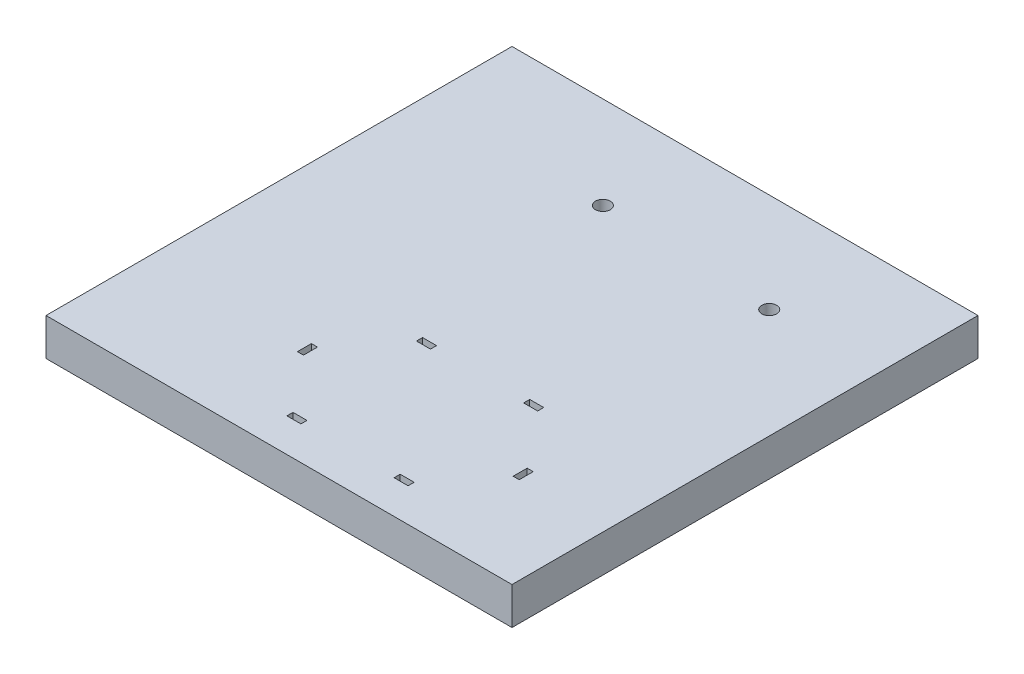
ISO-10303-21;
HEADER;
FILE_DESCRIPTION(('STEP AP214'),'2;1');
FILE_NAME('part.step','',(''),(''),'','','');
FILE_SCHEMA(('AUTOMOTIVE_DESIGN { 1 0 10303 214 1 1 1 1 }'));
ENDSEC;
DATA;
#1=APPLICATION_CONTEXT('core data for automotive mechanical design processes');
#2=APPLICATION_PROTOCOL_DEFINITION('international standard','automotive_design',2000,#1);
#3=PRODUCT_CONTEXT('',#1,'mechanical');
#4=PRODUCT('Part','Part','',(#3));
#5=PRODUCT_RELATED_PRODUCT_CATEGORY('part','',(#4));
#6=PRODUCT_DEFINITION_FORMATION('','',#4);
#7=PRODUCT_DEFINITION_CONTEXT('part definition',#1,'design');
#8=PRODUCT_DEFINITION('design','',#6,#7);
#9=PRODUCT_DEFINITION_SHAPE('','',#8);
#10=(LENGTH_UNIT() NAMED_UNIT(*) SI_UNIT(.MILLI.,.METRE.));
#11=(NAMED_UNIT(*) PLANE_ANGLE_UNIT() SI_UNIT($,.RADIAN.));
#12=(NAMED_UNIT(*) SI_UNIT($,.STERADIAN.) SOLID_ANGLE_UNIT());
#13=UNCERTAINTY_MEASURE_WITH_UNIT(LENGTH_MEASURE(1.E-05),#10,'distance_accuracy_value','');
#14=(GEOMETRIC_REPRESENTATION_CONTEXT(3) GLOBAL_UNCERTAINTY_ASSIGNED_CONTEXT((#13)) GLOBAL_UNIT_ASSIGNED_CONTEXT((#10,
#11,#12)) REPRESENTATION_CONTEXT('',''));
#15=CARTESIAN_POINT('',(0.,0.,0.));
#16=DIRECTION('',(0.,0.,1.));
#17=DIRECTION('',(1.,0.,0.));
#18=AXIS2_PLACEMENT_3D('',#15,#16,#17);
#19=CARTESIAN_POINT('',(0.,8.,0.));
#20=DIRECTION('',(0.,1.,0.));
#21=DIRECTION('',(0.,0.,1.));
#22=AXIS2_PLACEMENT_3D('',#19,#20,#21);
#23=PLANE('',#22);
#24=CARTESIAN_POINT('',(26.5,8.,-28.7));
#25=DIRECTION('',(0.,1.,0.));
#26=DIRECTION('',(0.,0.,1.));
#27=AXIS2_PLACEMENT_3D('',#24,#25,#26);
#28=CIRCLE('',#27,1.6);
#29=CARTESIAN_POINT('',(26.5,8.,-27.1));
#30=VERTEX_POINT('',#29);
#31=EDGE_CURVE('E415',#30,#30,#28,.T.);
#32=ORIENTED_EDGE('',*,*,#31,.F.);
#33=EDGE_LOOP('',(#32));
#34=FACE_BOUND('',#33,.T.);
#35=DIRECTION('',(0.,0.,1.));
#36=VECTOR('',#35,1.);
#37=CARTESIAN_POINT('',(-50.,8.,-50.));
#38=LINE('',#37,#36);
#39=CARTESIAN_POINT('',(-50.,8.,-50.));
#40=VERTEX_POINT('',#39);
#41=CARTESIAN_POINT('',(-50.,8.,50.));
#42=VERTEX_POINT('',#41);
#43=EDGE_CURVE('E421',#40,#42,#38,.T.);
#44=ORIENTED_EDGE('',*,*,#43,.T.);
#45=DIRECTION('',(1.,0.,0.));
#46=VECTOR('',#45,1.);
#47=CARTESIAN_POINT('',(-50.,8.,50.));
#48=LINE('',#47,#46);
#49=CARTESIAN_POINT('',(50.,8.,50.));
#50=VERTEX_POINT('',#49);
#51=EDGE_CURVE('E424',#42,#50,#48,.T.);
#52=ORIENTED_EDGE('',*,*,#51,.T.);
#53=DIRECTION('',(0.,0.,-1.));
#54=VECTOR('',#53,1.);
#55=CARTESIAN_POINT('',(50.,8.,-50.));
#56=LINE('',#55,#54);
#57=CARTESIAN_POINT('',(50.,8.,-50.));
#58=VERTEX_POINT('',#57);
#59=EDGE_CURVE('E427',#50,#58,#56,.T.);
#60=ORIENTED_EDGE('',*,*,#59,.T.);
#61=DIRECTION('',(-1.,0.,0.));
#62=VECTOR('',#61,1.);
#63=CARTESIAN_POINT('',(-50.,8.,-50.));
#64=LINE('',#63,#62);
#65=EDGE_CURVE('E429',#58,#40,#64,.T.);
#66=ORIENTED_EDGE('',*,*,#65,.T.);
#67=EDGE_LOOP('',(#44,#52,#60,#66));
#68=FACE_BOUND('',#67,.T.);
#69=CARTESIAN_POINT('',(-10.7,8.,-30.2));
#70=DIRECTION('',(0.,1.,0.));
#71=DIRECTION('',(0.,0.,1.));
#72=AXIS2_PLACEMENT_3D('',#69,#70,#71);
#73=CIRCLE('',#72,1.6);
#74=CARTESIAN_POINT('',(-10.7,8.,-28.6));
#75=VERTEX_POINT('',#74);
#76=EDGE_CURVE('E409',#75,#75,#73,.T.);
#77=ORIENTED_EDGE('',*,*,#76,.F.);
#78=EDGE_LOOP('',(#77));
#79=FACE_BOUND('',#78,.T.);
#80=DIRECTION('',(1.,0.,0.));
#81=VECTOR('',#80,1.);
#82=CARTESIAN_POINT('',(-5.49999999999998,8.,15.));
#83=LINE('',#82,#81);
#84=CARTESIAN_POINT('',(-5.49999999999998,8.,15.));
#85=VERTEX_POINT('',#84);
#86=CARTESIAN_POINT('',(-2.49999999999996,8.,15.));
#87=VERTEX_POINT('',#86);
#88=EDGE_CURVE('E380',#85,#87,#83,.T.);
#89=ORIENTED_EDGE('',*,*,#88,.F.);
#90=DIRECTION('',(0.,0.,1.));
#91=VECTOR('',#90,1.);
#92=CARTESIAN_POINT('',(-5.49999999999998,8.,15.));
#93=LINE('',#92,#91);
#94=CARTESIAN_POINT('',(-5.49999999999998,8.,13.7));
#95=VERTEX_POINT('',#94);
#96=EDGE_CURVE('E378',#95,#85,#93,.T.);
#97=ORIENTED_EDGE('',*,*,#96,.F.);
#98=DIRECTION('',(-1.,0.,0.));
#99=VECTOR('',#98,1.);
#100=CARTESIAN_POINT('',(-5.49999999999998,8.,13.7));
#101=LINE('',#100,#99);
#102=CARTESIAN_POINT('',(-2.49999999999996,8.,13.7));
#103=VERTEX_POINT('',#102);
#104=EDGE_CURVE('E386',#103,#95,#101,.T.);
#105=ORIENTED_EDGE('',*,*,#104,.F.);
#106=DIRECTION('',(0.,0.,-1.));
#107=VECTOR('',#106,1.);
#108=CARTESIAN_POINT('',(-2.49999999999996,8.,15.));
#109=LINE('',#108,#107);
#110=EDGE_CURVE('E383',#87,#103,#109,.T.);
#111=ORIENTED_EDGE('',*,*,#110,.F.);
#112=EDGE_LOOP('',(#89,#97,#105,#111));
#113=FACE_BOUND('',#112,.T.);
#114=DIRECTION('',(-1.,0.,0.));
#115=VECTOR('',#114,1.);
#116=CARTESIAN_POINT('',(-15.,8.,26.75));
#117=LINE('',#116,#115);
#118=CARTESIAN_POINT('',(-15.,8.,26.75));
#119=VERTEX_POINT('',#118);
#120=CARTESIAN_POINT('',(-16.3,8.,26.75));
#121=VERTEX_POINT('',#120);
#122=EDGE_CURVE('E349',#119,#121,#117,.T.);
#123=ORIENTED_EDGE('',*,*,#122,.F.);
#124=DIRECTION('',(0.,0.,-1.));
#125=VECTOR('',#124,1.);
#126=CARTESIAN_POINT('',(-15.,8.,26.75));
#127=LINE('',#126,#125);
#128=CARTESIAN_POINT('',(-15.,8.,29.75));
#129=VERTEX_POINT('',#128);
#130=EDGE_CURVE('E347',#129,#119,#127,.T.);
#131=ORIENTED_EDGE('',*,*,#130,.F.);
#132=DIRECTION('',(1.,0.,0.));
#133=VECTOR('',#132,1.);
#134=CARTESIAN_POINT('',(-15.,8.,29.75));
#135=LINE('',#134,#133);
#136=CARTESIAN_POINT('',(-16.3,8.,29.75));
#137=VERTEX_POINT('',#136);
#138=EDGE_CURVE('E355',#137,#129,#135,.T.);
#139=ORIENTED_EDGE('',*,*,#138,.F.);
#140=DIRECTION('',(0.,0.,1.));
#141=VECTOR('',#140,1.);
#142=CARTESIAN_POINT('',(-16.3,8.,26.75));
#143=LINE('',#142,#141);
#144=EDGE_CURVE('E352',#121,#137,#143,.T.);
#145=ORIENTED_EDGE('',*,*,#144,.F.);
#146=EDGE_LOOP('',(#123,#131,#139,#145));
#147=FACE_BOUND('',#146,.T.);
#148=DIRECTION('',(-1.,0.,0.));
#149=VECTOR('',#148,1.);
#150=CARTESIAN_POINT('',(20.5000000000001,8.,13.7));
#151=LINE('',#150,#149);
#152=CARTESIAN_POINT('',(20.5000000000001,8.,13.7));
#153=VERTEX_POINT('',#152);
#154=CARTESIAN_POINT('',(17.5,8.,13.7));
#155=VERTEX_POINT('',#154);
#156=EDGE_CURVE('E318',#153,#155,#151,.T.);
#157=ORIENTED_EDGE('',*,*,#156,.F.);
#158=DIRECTION('',(0.,0.,-1.));
#159=VECTOR('',#158,1.);
#160=CARTESIAN_POINT('',(20.5000000000001,8.,15.));
#161=LINE('',#160,#159);
#162=CARTESIAN_POINT('',(20.5000000000001,8.,15.));
#163=VERTEX_POINT('',#162);
#164=EDGE_CURVE('E316',#163,#153,#161,.T.);
#165=ORIENTED_EDGE('',*,*,#164,.F.);
#166=DIRECTION('',(1.,0.,0.));
#167=VECTOR('',#166,1.);
#168=CARTESIAN_POINT('',(20.5000000000001,8.,15.));
#169=LINE('',#168,#167);
#170=CARTESIAN_POINT('',(17.5,8.,15.));
#171=VERTEX_POINT('',#170);
#172=EDGE_CURVE('E324',#171,#163,#169,.T.);
#173=ORIENTED_EDGE('',*,*,#172,.F.);
#174=DIRECTION('',(0.,0.,1.));
#175=VECTOR('',#174,1.);
#176=CARTESIAN_POINT('',(17.5,8.,15.));
#177=LINE('',#176,#175);
#178=EDGE_CURVE('E321',#155,#171,#177,.T.);
#179=ORIENTED_EDGE('',*,*,#178,.F.);
#180=EDGE_LOOP('',(#157,#165,#173,#179));
#181=FACE_BOUND('',#180,.T.);
#182=DIRECTION('',(1.,0.,0.));
#183=VECTOR('',#182,1.);
#184=CARTESIAN_POINT('',(30.0000000000001,8.,29.75));
#185=LINE('',#184,#183);
#186=CARTESIAN_POINT('',(30.0000000000001,8.,29.75));
#187=VERTEX_POINT('',#186);
#188=CARTESIAN_POINT('',(31.3000000000001,8.,29.75));
#189=VERTEX_POINT('',#188);
#190=EDGE_CURVE('E287',#187,#189,#185,.T.);
#191=ORIENTED_EDGE('',*,*,#190,.F.);
#192=DIRECTION('',(0.,0.,1.));
#193=VECTOR('',#192,1.);
#194=CARTESIAN_POINT('',(30.0000000000001,8.,26.75));
#195=LINE('',#194,#193);
#196=CARTESIAN_POINT('',(30.0000000000001,8.,26.75));
#197=VERTEX_POINT('',#196);
#198=EDGE_CURVE('E285',#197,#187,#195,.T.);
#199=ORIENTED_EDGE('',*,*,#198,.F.);
#200=DIRECTION('',(-1.,0.,0.));
#201=VECTOR('',#200,1.);
#202=CARTESIAN_POINT('',(30.0000000000001,8.,26.75));
#203=LINE('',#202,#201);
#204=CARTESIAN_POINT('',(31.3000000000001,8.,26.75));
#205=VERTEX_POINT('',#204);
#206=EDGE_CURVE('E293',#205,#197,#203,.T.);
#207=ORIENTED_EDGE('',*,*,#206,.F.);
#208=DIRECTION('',(0.,0.,-1.));
#209=VECTOR('',#208,1.);
#210=CARTESIAN_POINT('',(31.3000000000001,8.,26.75));
#211=LINE('',#210,#209);
#212=EDGE_CURVE('E290',#189,#205,#211,.T.);
#213=ORIENTED_EDGE('',*,*,#212,.F.);
#214=EDGE_LOOP('',(#191,#199,#207,#213));
#215=FACE_BOUND('',#214,.T.);
#216=DIRECTION('',(0.,0.,1.));
#217=VECTOR('',#216,1.);
#218=CARTESIAN_POINT('',(17.5,8.,41.5));
#219=LINE('',#218,#217);
#220=CARTESIAN_POINT('',(17.5,8.,41.5));
#221=VERTEX_POINT('',#220);
#222=CARTESIAN_POINT('',(17.5,8.,42.8));
#223=VERTEX_POINT('',#222);
#224=EDGE_CURVE('E256',#221,#223,#219,.T.);
#225=ORIENTED_EDGE('',*,*,#224,.F.);
#226=DIRECTION('',(-1.,0.,0.));
#227=VECTOR('',#226,1.);
#228=CARTESIAN_POINT('',(20.5000000000001,8.,41.5));
#229=LINE('',#228,#227);
#230=CARTESIAN_POINT('',(20.5000000000001,8.,41.5));
#231=VERTEX_POINT('',#230);
#232=EDGE_CURVE('E254',#231,#221,#229,.T.);
#233=ORIENTED_EDGE('',*,*,#232,.F.);
#234=DIRECTION('',(0.,0.,-1.));
#235=VECTOR('',#234,1.);
#236=CARTESIAN_POINT('',(20.5000000000001,8.,41.5));
#237=LINE('',#236,#235);
#238=CARTESIAN_POINT('',(20.5,8.,42.8));
#239=VERTEX_POINT('',#238);
#240=EDGE_CURVE('E262',#239,#231,#237,.T.);
#241=ORIENTED_EDGE('',*,*,#240,.F.);
#242=DIRECTION('',(1.,0.,0.));
#243=VECTOR('',#242,1.);
#244=CARTESIAN_POINT('',(20.5,8.,42.8));
#245=LINE('',#244,#243);
#246=EDGE_CURVE('E259',#223,#239,#245,.T.);
#247=ORIENTED_EDGE('',*,*,#246,.F.);
#248=EDGE_LOOP('',(#225,#233,#241,#247));
#249=FACE_BOUND('',#248,.T.);
#250=DIRECTION('',(1.,0.,0.));
#251=VECTOR('',#250,1.);
#252=CARTESIAN_POINT('',(-5.49999999999997,8.,42.8));
#253=LINE('',#252,#251);
#254=CARTESIAN_POINT('',(-5.49999999999997,8.,42.8));
#255=VERTEX_POINT('',#254);
#256=CARTESIAN_POINT('',(-2.49999999999996,8.,42.8));
#257=VERTEX_POINT('',#256);
#258=EDGE_CURVE('E226',#255,#257,#253,.T.);
#259=ORIENTED_EDGE('',*,*,#258,.F.);
#260=DIRECTION('',(0.,0.,1.));
#261=VECTOR('',#260,1.);
#262=CARTESIAN_POINT('',(-5.49999999999998,8.,41.5));
#263=LINE('',#262,#261);
#264=CARTESIAN_POINT('',(-5.49999999999998,8.,41.5));
#265=VERTEX_POINT('',#264);
#266=EDGE_CURVE('E218',#265,#255,#263,.T.);
#267=ORIENTED_EDGE('',*,*,#266,.F.);
#268=DIRECTION('',(-1.,0.,0.));
#269=VECTOR('',#268,1.);
#270=CARTESIAN_POINT('',(-5.49999999999998,8.,41.5));
#271=LINE('',#270,#269);
#272=CARTESIAN_POINT('',(-2.49999999999996,8.,41.5));
#273=VERTEX_POINT('',#272);
#274=EDGE_CURVE('E240',#273,#265,#271,.T.);
#275=ORIENTED_EDGE('',*,*,#274,.F.);
#276=DIRECTION('',(0.,0.,-1.));
#277=VECTOR('',#276,1.);
#278=CARTESIAN_POINT('',(-2.49999999999996,8.,41.5));
#279=LINE('',#278,#277);
#280=EDGE_CURVE('E238',#257,#273,#279,.T.);
#281=ORIENTED_EDGE('',*,*,#280,.F.);
#282=EDGE_LOOP('',(#259,#267,#275,#281));
#283=FACE_BOUND('',#282,.T.);
#284=ADVANCED_FACE('F33',(#34,#68,#79,#113,#147,#181,#215,#249,#283),#23,.T.);
#285=CARTESIAN_POINT('',(0.,0.,0.));
#286=DIRECTION('',(0.,1.,0.));
#287=DIRECTION('',(0.,0.,1.));
#288=AXIS2_PLACEMENT_3D('',#285,#286,#287);
#289=PLANE('',#288);
#290=DIRECTION('',(-1.,0.,0.));
#291=VECTOR('',#290,1.);
#292=CARTESIAN_POINT('',(20.5000000000001,0.,41.5));
#293=LINE('',#292,#291);
#294=CARTESIAN_POINT('',(20.5000000000001,0.,41.5));
#295=VERTEX_POINT('',#294);
#296=CARTESIAN_POINT('',(17.5,0.,41.5));
#297=VERTEX_POINT('',#296);
#298=EDGE_CURVE('E234',#295,#297,#293,.T.);
#299=ORIENTED_EDGE('',*,*,#298,.T.);
#300=DIRECTION('',(0.,0.,1.));
#301=VECTOR('',#300,1.);
#302=CARTESIAN_POINT('',(17.5,0.,41.5));
#303=LINE('',#302,#301);
#304=CARTESIAN_POINT('',(17.5,0.,42.8));
#305=VERTEX_POINT('',#304);
#306=EDGE_CURVE('E267',#297,#305,#303,.T.);
#307=ORIENTED_EDGE('',*,*,#306,.T.);
#308=DIRECTION('',(1.,0.,0.));
#309=VECTOR('',#308,1.);
#310=CARTESIAN_POINT('',(20.5,0.,42.8));
#311=LINE('',#310,#309);
#312=CARTESIAN_POINT('',(20.5,0.,42.8));
#313=VERTEX_POINT('',#312);
#314=EDGE_CURVE('E270',#305,#313,#311,.T.);
#315=ORIENTED_EDGE('',*,*,#314,.T.);
#316=DIRECTION('',(0.,0.,-1.));
#317=VECTOR('',#316,1.);
#318=CARTESIAN_POINT('',(20.5000000000001,0.,41.5));
#319=LINE('',#318,#317);
#320=EDGE_CURVE('E257',#313,#295,#319,.T.);
#321=ORIENTED_EDGE('',*,*,#320,.T.);
#322=EDGE_LOOP('',(#299,#307,#315,#321));
#323=FACE_BOUND('',#322,.T.);
#324=DIRECTION('',(0.,0.,-1.));
#325=VECTOR('',#324,1.);
#326=CARTESIAN_POINT('',(20.5000000000001,0.,15.));
#327=LINE('',#326,#325);
#328=CARTESIAN_POINT('',(20.5000000000001,0.,15.));
#329=VERTEX_POINT('',#328);
#330=CARTESIAN_POINT('',(20.5000000000001,0.,13.7));
#331=VERTEX_POINT('',#330);
#332=EDGE_CURVE('E315',#329,#331,#327,.T.);
#333=ORIENTED_EDGE('',*,*,#332,.T.);
#334=DIRECTION('',(-1.,0.,0.));
#335=VECTOR('',#334,1.);
#336=CARTESIAN_POINT('',(20.5000000000001,0.,13.7));
#337=LINE('',#336,#335);
#338=CARTESIAN_POINT('',(17.5,0.,13.7));
#339=VERTEX_POINT('',#338);
#340=EDGE_CURVE('E329',#331,#339,#337,.T.);
#341=ORIENTED_EDGE('',*,*,#340,.T.);
#342=DIRECTION('',(0.,0.,1.));
#343=VECTOR('',#342,1.);
#344=CARTESIAN_POINT('',(17.5,0.,15.));
#345=LINE('',#344,#343);
#346=CARTESIAN_POINT('',(17.5,0.,15.));
#347=VERTEX_POINT('',#346);
#348=EDGE_CURVE('E332',#339,#347,#345,.T.);
#349=ORIENTED_EDGE('',*,*,#348,.T.);
#350=DIRECTION('',(1.,0.,0.));
#351=VECTOR('',#350,1.);
#352=CARTESIAN_POINT('',(20.5000000000001,0.,15.));
#353=LINE('',#352,#351);
#354=EDGE_CURVE('E319',#347,#329,#353,.T.);
#355=ORIENTED_EDGE('',*,*,#354,.T.);
#356=EDGE_LOOP('',(#333,#341,#349,#355));
#357=FACE_BOUND('',#356,.T.);
#358=DIRECTION('',(0.,0.,1.));
#359=VECTOR('',#358,1.);
#360=CARTESIAN_POINT('',(-5.49999999999998,0.,15.));
#361=LINE('',#360,#359);
#362=CARTESIAN_POINT('',(-5.49999999999998,0.,13.7));
#363=VERTEX_POINT('',#362);
#364=CARTESIAN_POINT('',(-5.49999999999998,0.,15.));
#365=VERTEX_POINT('',#364);
#366=EDGE_CURVE('E377',#363,#365,#361,.T.);
#367=ORIENTED_EDGE('',*,*,#366,.T.);
#368=DIRECTION('',(1.,0.,0.));
#369=VECTOR('',#368,1.);
#370=CARTESIAN_POINT('',(-5.49999999999998,0.,15.));
#371=LINE('',#370,#369);
#372=CARTESIAN_POINT('',(-2.49999999999996,0.,15.));
#373=VERTEX_POINT('',#372);
#374=EDGE_CURVE('E391',#365,#373,#371,.T.);
#375=ORIENTED_EDGE('',*,*,#374,.T.);
#376=DIRECTION('',(0.,0.,-1.));
#377=VECTOR('',#376,1.);
#378=CARTESIAN_POINT('',(-2.49999999999996,0.,15.));
#379=LINE('',#378,#377);
#380=CARTESIAN_POINT('',(-2.49999999999996,0.,13.7));
#381=VERTEX_POINT('',#380);
#382=EDGE_CURVE('E394',#373,#381,#379,.T.);
#383=ORIENTED_EDGE('',*,*,#382,.T.);
#384=DIRECTION('',(-1.,0.,0.));
#385=VECTOR('',#384,1.);
#386=CARTESIAN_POINT('',(-5.49999999999998,0.,13.7));
#387=LINE('',#386,#385);
#388=EDGE_CURVE('E381',#381,#363,#387,.T.);
#389=ORIENTED_EDGE('',*,*,#388,.T.);
#390=EDGE_LOOP('',(#367,#375,#383,#389));
#391=FACE_BOUND('',#390,.T.);
#392=DIRECTION('',(0.,0.,1.));
#393=VECTOR('',#392,1.);
#394=CARTESIAN_POINT('',(-50.,0.,-50.));
#395=LINE('',#394,#393);
#396=CARTESIAN_POINT('',(-50.,0.,-50.));
#397=VERTEX_POINT('',#396);
#398=CARTESIAN_POINT('',(-50.,0.,50.));
#399=VERTEX_POINT('',#398);
#400=EDGE_CURVE('E418',#397,#399,#395,.T.);
#401=ORIENTED_EDGE('',*,*,#400,.F.);
#402=DIRECTION('',(-1.,0.,0.));
#403=VECTOR('',#402,1.);
#404=CARTESIAN_POINT('',(-50.,0.,-50.));
#405=LINE('',#404,#403);
#406=CARTESIAN_POINT('',(50.,0.,-50.));
#407=VERTEX_POINT('',#406);
#408=EDGE_CURVE('E425',#407,#397,#405,.T.);
#409=ORIENTED_EDGE('',*,*,#408,.F.);
#410=DIRECTION('',(0.,0.,-1.));
#411=VECTOR('',#410,1.);
#412=CARTESIAN_POINT('',(50.,0.,-50.));
#413=LINE('',#412,#411);
#414=CARTESIAN_POINT('',(50.,0.,50.));
#415=VERTEX_POINT('',#414);
#416=EDGE_CURVE('E436',#415,#407,#413,.T.);
#417=ORIENTED_EDGE('',*,*,#416,.F.);
#418=DIRECTION('',(1.,0.,0.));
#419=VECTOR('',#418,1.);
#420=CARTESIAN_POINT('',(-50.,0.,50.));
#421=LINE('',#420,#419);
#422=EDGE_CURVE('E434',#399,#415,#421,.T.);
#423=ORIENTED_EDGE('',*,*,#422,.F.);
#424=EDGE_LOOP('',(#401,#409,#417,#423));
#425=FACE_BOUND('',#424,.T.);
#426=CARTESIAN_POINT('',(26.5,0.,-28.7));
#427=DIRECTION('',(0.,1.,0.));
#428=DIRECTION('',(0.,0.,1.));
#429=AXIS2_PLACEMENT_3D('',#426,#427,#428);
#430=CIRCLE('',#429,1.6);
#431=CARTESIAN_POINT('',(26.5,0.,-27.1));
#432=VERTEX_POINT('',#431);
#433=EDGE_CURVE('E412',#432,#432,#430,.T.);
#434=ORIENTED_EDGE('',*,*,#433,.T.);
#435=EDGE_LOOP('',(#434));
#436=FACE_BOUND('',#435,.T.);
#437=CARTESIAN_POINT('',(-10.7,0.,-30.2));
#438=DIRECTION('',(0.,1.,0.));
#439=DIRECTION('',(0.,0.,1.));
#440=AXIS2_PLACEMENT_3D('',#437,#438,#439);
#441=CIRCLE('',#440,1.6);
#442=CARTESIAN_POINT('',(-10.7,0.,-28.6));
#443=VERTEX_POINT('',#442);
#444=EDGE_CURVE('E408',#443,#443,#441,.T.);
#445=ORIENTED_EDGE('',*,*,#444,.T.);
#446=EDGE_LOOP('',(#445));
#447=FACE_BOUND('',#446,.T.);
#448=DIRECTION('',(0.,0.,-1.));
#449=VECTOR('',#448,1.);
#450=CARTESIAN_POINT('',(-15.,0.,26.75));
#451=LINE('',#450,#449);
#452=CARTESIAN_POINT('',(-15.,0.,29.75));
#453=VERTEX_POINT('',#452);
#454=CARTESIAN_POINT('',(-15.,0.,26.75));
#455=VERTEX_POINT('',#454);
#456=EDGE_CURVE('E346',#453,#455,#451,.T.);
#457=ORIENTED_EDGE('',*,*,#456,.T.);
#458=DIRECTION('',(-1.,0.,0.));
#459=VECTOR('',#458,1.);
#460=CARTESIAN_POINT('',(-15.,0.,26.75));
#461=LINE('',#460,#459);
#462=CARTESIAN_POINT('',(-16.3,0.,26.75));
#463=VERTEX_POINT('',#462);
#464=EDGE_CURVE('E360',#455,#463,#461,.T.);
#465=ORIENTED_EDGE('',*,*,#464,.T.);
#466=DIRECTION('',(0.,0.,1.));
#467=VECTOR('',#466,1.);
#468=CARTESIAN_POINT('',(-16.3,0.,26.75));
#469=LINE('',#468,#467);
#470=CARTESIAN_POINT('',(-16.3,0.,29.75));
#471=VERTEX_POINT('',#470);
#472=EDGE_CURVE('E363',#463,#471,#469,.T.);
#473=ORIENTED_EDGE('',*,*,#472,.T.);
#474=DIRECTION('',(1.,0.,0.));
#475=VECTOR('',#474,1.);
#476=CARTESIAN_POINT('',(-15.,0.,29.75));
#477=LINE('',#476,#475);
#478=EDGE_CURVE('E350',#471,#453,#477,.T.);
#479=ORIENTED_EDGE('',*,*,#478,.T.);
#480=EDGE_LOOP('',(#457,#465,#473,#479));
#481=FACE_BOUND('',#480,.T.);
#482=DIRECTION('',(0.,0.,1.));
#483=VECTOR('',#482,1.);
#484=CARTESIAN_POINT('',(30.0000000000001,0.,26.75));
#485=LINE('',#484,#483);
#486=CARTESIAN_POINT('',(30.0000000000001,0.,26.75));
#487=VERTEX_POINT('',#486);
#488=CARTESIAN_POINT('',(30.0000000000001,0.,29.75));
#489=VERTEX_POINT('',#488);
#490=EDGE_CURVE('E284',#487,#489,#485,.T.);
#491=ORIENTED_EDGE('',*,*,#490,.T.);
#492=DIRECTION('',(1.,0.,0.));
#493=VECTOR('',#492,1.);
#494=CARTESIAN_POINT('',(30.0000000000001,0.,29.75));
#495=LINE('',#494,#493);
#496=CARTESIAN_POINT('',(31.3000000000001,0.,29.75));
#497=VERTEX_POINT('',#496);
#498=EDGE_CURVE('E298',#489,#497,#495,.T.);
#499=ORIENTED_EDGE('',*,*,#498,.T.);
#500=DIRECTION('',(0.,0.,-1.));
#501=VECTOR('',#500,1.);
#502=CARTESIAN_POINT('',(31.3000000000001,0.,26.75));
#503=LINE('',#502,#501);
#504=CARTESIAN_POINT('',(31.3000000000001,0.,26.75));
#505=VERTEX_POINT('',#504);
#506=EDGE_CURVE('E301',#497,#505,#503,.T.);
#507=ORIENTED_EDGE('',*,*,#506,.T.);
#508=DIRECTION('',(-1.,0.,0.));
#509=VECTOR('',#508,1.);
#510=CARTESIAN_POINT('',(30.0000000000001,0.,26.75));
#511=LINE('',#510,#509);
#512=EDGE_CURVE('E288',#505,#487,#511,.T.);
#513=ORIENTED_EDGE('',*,*,#512,.T.);
#514=EDGE_LOOP('',(#491,#499,#507,#513));
#515=FACE_BOUND('',#514,.T.);
#516=DIRECTION('',(0.,0.,1.));
#517=VECTOR('',#516,1.);
#518=CARTESIAN_POINT('',(-5.49999999999998,0.,41.5));
#519=LINE('',#518,#517);
#520=CARTESIAN_POINT('',(-5.49999999999998,0.,41.5));
#521=VERTEX_POINT('',#520);
#522=CARTESIAN_POINT('',(-5.49999999999997,0.,42.8));
#523=VERTEX_POINT('',#522);
#524=EDGE_CURVE('E56',#521,#523,#519,.T.);
#525=ORIENTED_EDGE('',*,*,#524,.T.);
#526=DIRECTION('',(1.,0.,0.));
#527=VECTOR('',#526,1.);
#528=CARTESIAN_POINT('',(-5.49999999999997,0.,42.8));
#529=LINE('',#528,#527);
#530=CARTESIAN_POINT('',(-2.49999999999996,0.,42.8));
#531=VERTEX_POINT('',#530);
#532=EDGE_CURVE('E233',#523,#531,#529,.T.);
#533=ORIENTED_EDGE('',*,*,#532,.T.);
#534=DIRECTION('',(0.,0.,-1.));
#535=VECTOR('',#534,1.);
#536=CARTESIAN_POINT('',(-2.49999999999996,0.,41.5));
#537=LINE('',#536,#535);
#538=CARTESIAN_POINT('',(-2.49999999999996,0.,41.5));
#539=VERTEX_POINT('',#538);
#540=EDGE_CURVE('E246',#531,#539,#537,.T.);
#541=ORIENTED_EDGE('',*,*,#540,.T.);
#542=DIRECTION('',(-1.,0.,0.));
#543=VECTOR('',#542,1.);
#544=CARTESIAN_POINT('',(-5.49999999999998,0.,41.5));
#545=LINE('',#544,#543);
#546=EDGE_CURVE('E227',#539,#521,#545,.T.);
#547=ORIENTED_EDGE('',*,*,#546,.T.);
#548=EDGE_LOOP('',(#525,#533,#541,#547));
#549=FACE_BOUND('',#548,.T.);
#550=ADVANCED_FACE('F454',(#323,#357,#391,#425,#436,#447,#481,#515,#549),#289,.F.);
#551=CARTESIAN_POINT('',(-50.,8.,-50.));
#552=DIRECTION('',(1.,0.,0.));
#553=DIRECTION('',(0.,0.,-1.));
#554=AXIS2_PLACEMENT_3D('',#551,#552,#553);
#555=PLANE('',#554);
#556=ORIENTED_EDGE('',*,*,#400,.T.);
#557=DIRECTION('',(0.,-1.,0.));
#558=VECTOR('',#557,1.);
#559=CARTESIAN_POINT('',(-50.,8.,50.));
#560=LINE('',#559,#558);
#561=EDGE_CURVE('E11',#42,#399,#560,.T.);
#562=ORIENTED_EDGE('',*,*,#561,.F.);
#563=ORIENTED_EDGE('',*,*,#43,.F.);
#564=DIRECTION('',(0.,-1.,0.));
#565=VECTOR('',#564,1.);
#566=CARTESIAN_POINT('',(-50.,8.,-50.));
#567=LINE('',#566,#565);
#568=EDGE_CURVE('E431',#40,#397,#567,.T.);
#569=ORIENTED_EDGE('',*,*,#568,.T.);
#570=EDGE_LOOP('',(#556,#562,#563,#569));
#571=FACE_BOUND('',#570,.T.);
#572=ADVANCED_FACE('F35',(#571),#555,.F.);
#573=CARTESIAN_POINT('',(-50.,8.,50.));
#574=DIRECTION('',(0.,0.,-1.));
#575=DIRECTION('',(-1.,0.,0.));
#576=AXIS2_PLACEMENT_3D('',#573,#574,#575);
#577=PLANE('',#576);
#578=ORIENTED_EDGE('',*,*,#422,.T.);
#579=DIRECTION('',(0.,-1.,0.));
#580=VECTOR('',#579,1.);
#581=CARTESIAN_POINT('',(50.,8.,50.));
#582=LINE('',#581,#580);
#583=EDGE_CURVE('E41',#50,#415,#582,.T.);
#584=ORIENTED_EDGE('',*,*,#583,.F.);
#585=ORIENTED_EDGE('',*,*,#51,.F.);
#586=ORIENTED_EDGE('',*,*,#561,.T.);
#587=EDGE_LOOP('',(#578,#584,#585,#586));
#588=FACE_BOUND('',#587,.T.);
#589=ADVANCED_FACE('F465',(#588),#577,.F.);
#590=CARTESIAN_POINT('',(50.,8.,-50.));
#591=DIRECTION('',(-1.,0.,0.));
#592=DIRECTION('',(0.,0.,1.));
#593=AXIS2_PLACEMENT_3D('',#590,#591,#592);
#594=PLANE('',#593);
#595=ORIENTED_EDGE('',*,*,#416,.T.);
#596=DIRECTION('',(0.,-1.,0.));
#597=VECTOR('',#596,1.);
#598=CARTESIAN_POINT('',(50.,8.,-50.));
#599=LINE('',#598,#597);
#600=EDGE_CURVE('E441',#58,#407,#599,.T.);
#601=ORIENTED_EDGE('',*,*,#600,.F.);
#602=ORIENTED_EDGE('',*,*,#59,.F.);
#603=ORIENTED_EDGE('',*,*,#583,.T.);
#604=EDGE_LOOP('',(#595,#601,#602,#603));
#605=FACE_BOUND('',#604,.T.);
#606=ADVANCED_FACE('F448',(#605),#594,.F.);
#607=CARTESIAN_POINT('',(-50.,8.,-50.));
#608=DIRECTION('',(0.,0.,1.));
#609=DIRECTION('',(1.,0.,0.));
#610=AXIS2_PLACEMENT_3D('',#607,#608,#609);
#611=PLANE('',#610);
#612=ORIENTED_EDGE('',*,*,#408,.T.);
#613=ORIENTED_EDGE('',*,*,#568,.F.);
#614=ORIENTED_EDGE('',*,*,#65,.F.);
#615=ORIENTED_EDGE('',*,*,#600,.T.);
#616=EDGE_LOOP('',(#612,#613,#614,#615));
#617=FACE_BOUND('',#616,.T.);
#618=ADVANCED_FACE('F458',(#617),#611,.F.);
#619=CARTESIAN_POINT('',(26.5,8.,-28.7));
#620=DIRECTION('',(0.,-1.,0.));
#621=DIRECTION('',(0.,0.,-1.));
#622=AXIS2_PLACEMENT_3D('',#619,#620,#621);
#623=CYLINDRICAL_SURFACE('',#622,1.6);
#624=ORIENTED_EDGE('',*,*,#31,.T.);
#625=EDGE_LOOP('',(#624));
#626=FACE_BOUND('',#625,.T.);
#627=ORIENTED_EDGE('',*,*,#433,.F.);
#628=EDGE_LOOP('',(#627));
#629=FACE_BOUND('',#628,.T.);
#630=ADVANCED_FACE('F482',(#626,#629),#623,.F.);
#631=CARTESIAN_POINT('',(-10.7,8.,-30.2));
#632=DIRECTION('',(0.,-1.,0.));
#633=DIRECTION('',(0.,0.,-1.));
#634=AXIS2_PLACEMENT_3D('',#631,#632,#633);
#635=CYLINDRICAL_SURFACE('',#634,1.6);
#636=ORIENTED_EDGE('',*,*,#76,.T.);
#637=EDGE_LOOP('',(#636));
#638=FACE_BOUND('',#637,.T.);
#639=ORIENTED_EDGE('',*,*,#444,.F.);
#640=EDGE_LOOP('',(#639));
#641=FACE_BOUND('',#640,.T.);
#642=ADVANCED_FACE('F489',(#638,#641),#635,.F.);
#643=CARTESIAN_POINT('',(-5.49999999999998,8.,15.));
#644=DIRECTION('',(1.,0.,0.));
#645=DIRECTION('',(0.,0.,-1.));
#646=AXIS2_PLACEMENT_3D('',#643,#644,#645);
#647=PLANE('',#646);
#648=ORIENTED_EDGE('',*,*,#366,.F.);
#649=DIRECTION('',(0.,-1.,0.));
#650=VECTOR('',#649,1.);
#651=CARTESIAN_POINT('',(-5.49999999999998,8.,13.7));
#652=LINE('',#651,#650);
#653=EDGE_CURVE('E388',#95,#363,#652,.T.);
#654=ORIENTED_EDGE('',*,*,#653,.F.);
#655=ORIENTED_EDGE('',*,*,#96,.T.);
#656=DIRECTION('',(0.,-1.,0.));
#657=VECTOR('',#656,1.);
#658=CARTESIAN_POINT('',(-5.49999999999998,8.,15.));
#659=LINE('',#658,#657);
#660=EDGE_CURVE('E405',#85,#365,#659,.T.);
#661=ORIENTED_EDGE('',*,*,#660,.T.);
#662=EDGE_LOOP('',(#648,#654,#655,#661));
#663=FACE_BOUND('',#662,.T.);
#664=ADVANCED_FACE('F494',(#663),#647,.T.);
#665=CARTESIAN_POINT('',(-5.49999999999998,8.,15.));
#666=DIRECTION('',(0.,0.,-1.));
#667=DIRECTION('',(-1.,0.,0.));
#668=AXIS2_PLACEMENT_3D('',#665,#666,#667);
#669=PLANE('',#668);
#670=ORIENTED_EDGE('',*,*,#374,.F.);
#671=ORIENTED_EDGE('',*,*,#660,.F.);
#672=ORIENTED_EDGE('',*,*,#88,.T.);
#673=DIRECTION('',(0.,-1.,0.));
#674=VECTOR('',#673,1.);
#675=CARTESIAN_POINT('',(-2.49999999999996,8.,15.));
#676=LINE('',#675,#674);
#677=EDGE_CURVE('E403',#87,#373,#676,.T.);
#678=ORIENTED_EDGE('',*,*,#677,.T.);
#679=EDGE_LOOP('',(#670,#671,#672,#678));
#680=FACE_BOUND('',#679,.T.);
#681=ADVANCED_FACE('F589',(#680),#669,.T.);
#682=CARTESIAN_POINT('',(-2.49999999999996,8.,15.));
#683=DIRECTION('',(-1.,0.,0.));
#684=DIRECTION('',(0.,0.,1.));
#685=AXIS2_PLACEMENT_3D('',#682,#683,#684);
#686=PLANE('',#685);
#687=ORIENTED_EDGE('',*,*,#382,.F.);
#688=ORIENTED_EDGE('',*,*,#677,.F.);
#689=ORIENTED_EDGE('',*,*,#110,.T.);
#690=DIRECTION('',(0.,-1.,0.));
#691=VECTOR('',#690,1.);
#692=CARTESIAN_POINT('',(-2.49999999999996,8.,13.7));
#693=LINE('',#692,#691);
#694=EDGE_CURVE('E401',#103,#381,#693,.T.);
#695=ORIENTED_EDGE('',*,*,#694,.T.);
#696=EDGE_LOOP('',(#687,#688,#689,#695));
#697=FACE_BOUND('',#696,.T.);
#698=ADVANCED_FACE('F585',(#697),#686,.T.);
#699=CARTESIAN_POINT('',(-5.49999999999998,8.,13.7));
#700=DIRECTION('',(0.,0.,1.));
#701=DIRECTION('',(1.,0.,0.));
#702=AXIS2_PLACEMENT_3D('',#699,#700,#701);
#703=PLANE('',#702);
#704=ORIENTED_EDGE('',*,*,#388,.F.);
#705=ORIENTED_EDGE('',*,*,#694,.F.);
#706=ORIENTED_EDGE('',*,*,#104,.T.);
#707=ORIENTED_EDGE('',*,*,#653,.T.);
#708=EDGE_LOOP('',(#704,#705,#706,#707));
#709=FACE_BOUND('',#708,.T.);
#710=ADVANCED_FACE('F581',(#709),#703,.T.);
#711=CARTESIAN_POINT('',(-15.,8.,26.75));
#712=DIRECTION('',(-1.,0.,0.));
#713=DIRECTION('',(0.,0.,1.));
#714=AXIS2_PLACEMENT_3D('',#711,#712,#713);
#715=PLANE('',#714);
#716=ORIENTED_EDGE('',*,*,#456,.F.);
#717=DIRECTION('',(0.,-1.,0.));
#718=VECTOR('',#717,1.);
#719=CARTESIAN_POINT('',(-15.,8.,29.75));
#720=LINE('',#719,#718);
#721=EDGE_CURVE('E357',#129,#453,#720,.T.);
#722=ORIENTED_EDGE('',*,*,#721,.F.);
#723=ORIENTED_EDGE('',*,*,#130,.T.);
#724=DIRECTION('',(0.,-1.,0.));
#725=VECTOR('',#724,1.);
#726=CARTESIAN_POINT('',(-15.,8.,26.75));
#727=LINE('',#726,#725);
#728=EDGE_CURVE('E374',#119,#455,#727,.T.);
#729=ORIENTED_EDGE('',*,*,#728,.T.);
#730=EDGE_LOOP('',(#716,#722,#723,#729));
#731=FACE_BOUND('',#730,.T.);
#732=ADVANCED_FACE('F577',(#731),#715,.T.);
#733=CARTESIAN_POINT('',(-15.,8.,26.75));
#734=DIRECTION('',(0.,0.,1.));
#735=DIRECTION('',(1.,0.,0.));
#736=AXIS2_PLACEMENT_3D('',#733,#734,#735);
#737=PLANE('',#736);
#738=ORIENTED_EDGE('',*,*,#464,.F.);
#739=ORIENTED_EDGE('',*,*,#728,.F.);
#740=ORIENTED_EDGE('',*,*,#122,.T.);
#741=DIRECTION('',(0.,-1.,0.));
#742=VECTOR('',#741,1.);
#743=CARTESIAN_POINT('',(-16.3,8.,26.75));
#744=LINE('',#743,#742);
#745=EDGE_CURVE('E372',#121,#463,#744,.T.);
#746=ORIENTED_EDGE('',*,*,#745,.T.);
#747=EDGE_LOOP('',(#738,#739,#740,#746));
#748=FACE_BOUND('',#747,.T.);
#749=ADVANCED_FACE('F573',(#748),#737,.T.);
#750=CARTESIAN_POINT('',(-16.3,8.,26.75));
#751=DIRECTION('',(1.,0.,0.));
#752=DIRECTION('',(0.,0.,-1.));
#753=AXIS2_PLACEMENT_3D('',#750,#751,#752);
#754=PLANE('',#753);
#755=ORIENTED_EDGE('',*,*,#472,.F.);
#756=ORIENTED_EDGE('',*,*,#745,.F.);
#757=ORIENTED_EDGE('',*,*,#144,.T.);
#758=DIRECTION('',(0.,-1.,0.));
#759=VECTOR('',#758,1.);
#760=CARTESIAN_POINT('',(-16.3,8.,29.75));
#761=LINE('',#760,#759);
#762=EDGE_CURVE('E370',#137,#471,#761,.T.);
#763=ORIENTED_EDGE('',*,*,#762,.T.);
#764=EDGE_LOOP('',(#755,#756,#757,#763));
#765=FACE_BOUND('',#764,.T.);
#766=ADVANCED_FACE('F569',(#765),#754,.T.);
#767=CARTESIAN_POINT('',(-15.,8.,29.75));
#768=DIRECTION('',(0.,0.,-1.));
#769=DIRECTION('',(-1.,0.,0.));
#770=AXIS2_PLACEMENT_3D('',#767,#768,#769);
#771=PLANE('',#770);
#772=ORIENTED_EDGE('',*,*,#478,.F.);
#773=ORIENTED_EDGE('',*,*,#762,.F.);
#774=ORIENTED_EDGE('',*,*,#138,.T.);
#775=ORIENTED_EDGE('',*,*,#721,.T.);
#776=EDGE_LOOP('',(#772,#773,#774,#775));
#777=FACE_BOUND('',#776,.T.);
#778=ADVANCED_FACE('F565',(#777),#771,.T.);
#779=CARTESIAN_POINT('',(20.5000000000001,8.,15.));
#780=DIRECTION('',(-1.,0.,0.));
#781=DIRECTION('',(0.,0.,1.));
#782=AXIS2_PLACEMENT_3D('',#779,#780,#781);
#783=PLANE('',#782);
#784=ORIENTED_EDGE('',*,*,#332,.F.);
#785=DIRECTION('',(0.,-1.,0.));
#786=VECTOR('',#785,1.);
#787=CARTESIAN_POINT('',(20.5000000000001,8.,15.));
#788=LINE('',#787,#786);
#789=EDGE_CURVE('E326',#163,#329,#788,.T.);
#790=ORIENTED_EDGE('',*,*,#789,.F.);
#791=ORIENTED_EDGE('',*,*,#164,.T.);
#792=DIRECTION('',(0.,-1.,0.));
#793=VECTOR('',#792,1.);
#794=CARTESIAN_POINT('',(20.5000000000001,8.,13.7));
#795=LINE('',#794,#793);
#796=EDGE_CURVE('E343',#153,#331,#795,.T.);
#797=ORIENTED_EDGE('',*,*,#796,.T.);
#798=EDGE_LOOP('',(#784,#790,#791,#797));
#799=FACE_BOUND('',#798,.T.);
#800=ADVANCED_FACE('F561',(#799),#783,.T.);
#801=CARTESIAN_POINT('',(20.5000000000001,8.,13.7));
#802=DIRECTION('',(0.,0.,1.));
#803=DIRECTION('',(1.,0.,0.));
#804=AXIS2_PLACEMENT_3D('',#801,#802,#803);
#805=PLANE('',#804);
#806=ORIENTED_EDGE('',*,*,#340,.F.);
#807=ORIENTED_EDGE('',*,*,#796,.F.);
#808=ORIENTED_EDGE('',*,*,#156,.T.);
#809=DIRECTION('',(0.,-1.,0.));
#810=VECTOR('',#809,1.);
#811=CARTESIAN_POINT('',(17.5,8.,13.7));
#812=LINE('',#811,#810);
#813=EDGE_CURVE('E341',#155,#339,#812,.T.);
#814=ORIENTED_EDGE('',*,*,#813,.T.);
#815=EDGE_LOOP('',(#806,#807,#808,#814));
#816=FACE_BOUND('',#815,.T.);
#817=ADVANCED_FACE('F557',(#816),#805,.T.);
#818=CARTESIAN_POINT('',(17.5,8.,15.));
#819=DIRECTION('',(1.,0.,0.));
#820=DIRECTION('',(0.,0.,-1.));
#821=AXIS2_PLACEMENT_3D('',#818,#819,#820);
#822=PLANE('',#821);
#823=ORIENTED_EDGE('',*,*,#348,.F.);
#824=ORIENTED_EDGE('',*,*,#813,.F.);
#825=ORIENTED_EDGE('',*,*,#178,.T.);
#826=DIRECTION('',(0.,-1.,0.));
#827=VECTOR('',#826,1.);
#828=CARTESIAN_POINT('',(17.5,8.,15.));
#829=LINE('',#828,#827);
#830=EDGE_CURVE('E339',#171,#347,#829,.T.);
#831=ORIENTED_EDGE('',*,*,#830,.T.);
#832=EDGE_LOOP('',(#823,#824,#825,#831));
#833=FACE_BOUND('',#832,.T.);
#834=ADVANCED_FACE('F553',(#833),#822,.T.);
#835=CARTESIAN_POINT('',(20.5000000000001,8.,15.));
#836=DIRECTION('',(0.,0.,-1.));
#837=DIRECTION('',(-1.,0.,0.));
#838=AXIS2_PLACEMENT_3D('',#835,#836,#837);
#839=PLANE('',#838);
#840=ORIENTED_EDGE('',*,*,#354,.F.);
#841=ORIENTED_EDGE('',*,*,#830,.F.);
#842=ORIENTED_EDGE('',*,*,#172,.T.);
#843=ORIENTED_EDGE('',*,*,#789,.T.);
#844=EDGE_LOOP('',(#840,#841,#842,#843));
#845=FACE_BOUND('',#844,.T.);
#846=ADVANCED_FACE('F549',(#845),#839,.T.);
#847=CARTESIAN_POINT('',(30.0000000000001,8.,26.75));
#848=DIRECTION('',(1.,0.,0.));
#849=DIRECTION('',(0.,0.,-1.));
#850=AXIS2_PLACEMENT_3D('',#847,#848,#849);
#851=PLANE('',#850);
#852=ORIENTED_EDGE('',*,*,#490,.F.);
#853=DIRECTION('',(0.,-1.,0.));
#854=VECTOR('',#853,1.);
#855=CARTESIAN_POINT('',(30.0000000000001,8.,26.75));
#856=LINE('',#855,#854);
#857=EDGE_CURVE('E295',#197,#487,#856,.T.);
#858=ORIENTED_EDGE('',*,*,#857,.F.);
#859=ORIENTED_EDGE('',*,*,#198,.T.);
#860=DIRECTION('',(0.,-1.,0.));
#861=VECTOR('',#860,1.);
#862=CARTESIAN_POINT('',(30.0000000000001,8.,29.75));
#863=LINE('',#862,#861);
#864=EDGE_CURVE('E312',#187,#489,#863,.T.);
#865=ORIENTED_EDGE('',*,*,#864,.T.);
#866=EDGE_LOOP('',(#852,#858,#859,#865));
#867=FACE_BOUND('',#866,.T.);
#868=ADVANCED_FACE('F545',(#867),#851,.T.);
#869=CARTESIAN_POINT('',(30.0000000000001,8.,29.75));
#870=DIRECTION('',(0.,0.,-1.));
#871=DIRECTION('',(-1.,0.,0.));
#872=AXIS2_PLACEMENT_3D('',#869,#870,#871);
#873=PLANE('',#872);
#874=ORIENTED_EDGE('',*,*,#498,.F.);
#875=ORIENTED_EDGE('',*,*,#864,.F.);
#876=ORIENTED_EDGE('',*,*,#190,.T.);
#877=DIRECTION('',(0.,-1.,0.));
#878=VECTOR('',#877,1.);
#879=CARTESIAN_POINT('',(31.3000000000001,8.,29.75));
#880=LINE('',#879,#878);
#881=EDGE_CURVE('E310',#189,#497,#880,.T.);
#882=ORIENTED_EDGE('',*,*,#881,.T.);
#883=EDGE_LOOP('',(#874,#875,#876,#882));
#884=FACE_BOUND('',#883,.T.);
#885=ADVANCED_FACE('F541',(#884),#873,.T.);
#886=CARTESIAN_POINT('',(31.3000000000001,8.,26.75));
#887=DIRECTION('',(-1.,0.,0.));
#888=DIRECTION('',(0.,0.,1.));
#889=AXIS2_PLACEMENT_3D('',#886,#887,#888);
#890=PLANE('',#889);
#891=ORIENTED_EDGE('',*,*,#506,.F.);
#892=ORIENTED_EDGE('',*,*,#881,.F.);
#893=ORIENTED_EDGE('',*,*,#212,.T.);
#894=DIRECTION('',(0.,-1.,0.));
#895=VECTOR('',#894,1.);
#896=CARTESIAN_POINT('',(31.3000000000001,8.,26.75));
#897=LINE('',#896,#895);
#898=EDGE_CURVE('E308',#205,#505,#897,.T.);
#899=ORIENTED_EDGE('',*,*,#898,.T.);
#900=EDGE_LOOP('',(#891,#892,#893,#899));
#901=FACE_BOUND('',#900,.T.);
#902=ADVANCED_FACE('F537',(#901),#890,.T.);
#903=CARTESIAN_POINT('',(30.0000000000001,8.,26.75));
#904=DIRECTION('',(0.,0.,1.));
#905=DIRECTION('',(1.,0.,0.));
#906=AXIS2_PLACEMENT_3D('',#903,#904,#905);
#907=PLANE('',#906);
#908=ORIENTED_EDGE('',*,*,#512,.F.);
#909=ORIENTED_EDGE('',*,*,#898,.F.);
#910=ORIENTED_EDGE('',*,*,#206,.T.);
#911=ORIENTED_EDGE('',*,*,#857,.T.);
#912=EDGE_LOOP('',(#908,#909,#910,#911));
#913=FACE_BOUND('',#912,.T.);
#914=ADVANCED_FACE('F533',(#913),#907,.T.);
#915=CARTESIAN_POINT('',(20.5000000000001,8.,41.5));
#916=DIRECTION('',(0.,0.,1.));
#917=DIRECTION('',(1.,0.,0.));
#918=AXIS2_PLACEMENT_3D('',#915,#916,#917);
#919=PLANE('',#918);
#920=ORIENTED_EDGE('',*,*,#298,.F.);
#921=DIRECTION('',(0.,-1.,0.));
#922=VECTOR('',#921,1.);
#923=CARTESIAN_POINT('',(20.5000000000001,8.,41.5));
#924=LINE('',#923,#922);
#925=EDGE_CURVE('E264',#231,#295,#924,.T.);
#926=ORIENTED_EDGE('',*,*,#925,.F.);
#927=ORIENTED_EDGE('',*,*,#232,.T.);
#928=DIRECTION('',(0.,-1.,0.));
#929=VECTOR('',#928,1.);
#930=CARTESIAN_POINT('',(17.5,8.,41.5));
#931=LINE('',#930,#929);
#932=EDGE_CURVE('E281',#221,#297,#931,.T.);
#933=ORIENTED_EDGE('',*,*,#932,.T.);
#934=EDGE_LOOP('',(#920,#926,#927,#933));
#935=FACE_BOUND('',#934,.T.);
#936=ADVANCED_FACE('F529',(#935),#919,.T.);
#937=CARTESIAN_POINT('',(17.5,8.,41.5));
#938=DIRECTION('',(1.,0.,0.));
#939=DIRECTION('',(0.,0.,-1.));
#940=AXIS2_PLACEMENT_3D('',#937,#938,#939);
#941=PLANE('',#940);
#942=ORIENTED_EDGE('',*,*,#306,.F.);
#943=ORIENTED_EDGE('',*,*,#932,.F.);
#944=ORIENTED_EDGE('',*,*,#224,.T.);
#945=DIRECTION('',(0.,-1.,0.));
#946=VECTOR('',#945,1.);
#947=CARTESIAN_POINT('',(17.5,8.,42.8));
#948=LINE('',#947,#946);
#949=EDGE_CURVE('E279',#223,#305,#948,.T.);
#950=ORIENTED_EDGE('',*,*,#949,.T.);
#951=EDGE_LOOP('',(#942,#943,#944,#950));
#952=FACE_BOUND('',#951,.T.);
#953=ADVANCED_FACE('F525',(#952),#941,.T.);
#954=CARTESIAN_POINT('',(20.5,8.,42.8));
#955=DIRECTION('',(0.,0.,-1.));
#956=DIRECTION('',(-1.,0.,0.));
#957=AXIS2_PLACEMENT_3D('',#954,#955,#956);
#958=PLANE('',#957);
#959=ORIENTED_EDGE('',*,*,#314,.F.);
#960=ORIENTED_EDGE('',*,*,#949,.F.);
#961=ORIENTED_EDGE('',*,*,#246,.T.);
#962=DIRECTION('',(0.,-1.,0.));
#963=VECTOR('',#962,1.);
#964=CARTESIAN_POINT('',(20.5,8.,42.8));
#965=LINE('',#964,#963);
#966=EDGE_CURVE('E277',#239,#313,#965,.T.);
#967=ORIENTED_EDGE('',*,*,#966,.T.);
#968=EDGE_LOOP('',(#959,#960,#961,#967));
#969=FACE_BOUND('',#968,.T.);
#970=ADVANCED_FACE('F521',(#969),#958,.T.);
#971=CARTESIAN_POINT('',(20.5000000000001,8.,41.5));
#972=DIRECTION('',(-1.,0.,0.));
#973=DIRECTION('',(0.,0.,1.));
#974=AXIS2_PLACEMENT_3D('',#971,#972,#973);
#975=PLANE('',#974);
#976=ORIENTED_EDGE('',*,*,#320,.F.);
#977=ORIENTED_EDGE('',*,*,#966,.F.);
#978=ORIENTED_EDGE('',*,*,#240,.T.);
#979=ORIENTED_EDGE('',*,*,#925,.T.);
#980=EDGE_LOOP('',(#976,#977,#978,#979));
#981=FACE_BOUND('',#980,.T.);
#982=ADVANCED_FACE('F518',(#981),#975,.T.);
#983=CARTESIAN_POINT('',(-5.49999999999998,8.,41.5));
#984=DIRECTION('',(1.,0.,0.));
#985=DIRECTION('',(0.,0.,-1.));
#986=AXIS2_PLACEMENT_3D('',#983,#984,#985);
#987=PLANE('',#986);
#988=ORIENTED_EDGE('',*,*,#524,.F.);
#989=DIRECTION('',(0.,-1.,0.));
#990=VECTOR('',#989,1.);
#991=CARTESIAN_POINT('',(-5.49999999999998,8.,41.5));
#992=LINE('',#991,#990);
#993=EDGE_CURVE('E222',#265,#521,#992,.T.);
#994=ORIENTED_EDGE('',*,*,#993,.F.);
#995=ORIENTED_EDGE('',*,*,#266,.T.);
#996=DIRECTION('',(0.,-1.,0.));
#997=VECTOR('',#996,1.);
#998=CARTESIAN_POINT('',(-5.49999999999997,8.,42.8));
#999=LINE('',#998,#997);
#1000=EDGE_CURVE('E221',#255,#523,#999,.T.);
#1001=ORIENTED_EDGE('',*,*,#1000,.T.);
#1002=EDGE_LOOP('',(#988,#994,#995,#1001));
#1003=FACE_BOUND('',#1002,.T.);
#1004=ADVANCED_FACE('F220',(#1003),#987,.T.);
#1005=CARTESIAN_POINT('',(-5.49999999999997,8.,42.8));
#1006=DIRECTION('',(0.,0.,-1.));
#1007=DIRECTION('',(-1.,0.,0.));
#1008=AXIS2_PLACEMENT_3D('',#1005,#1006,#1007);
#1009=PLANE('',#1008);
#1010=ORIENTED_EDGE('',*,*,#532,.F.);
#1011=ORIENTED_EDGE('',*,*,#1000,.F.);
#1012=ORIENTED_EDGE('',*,*,#258,.T.);
#1013=DIRECTION('',(0.,-1.,0.));
#1014=VECTOR('',#1013,1.);
#1015=CARTESIAN_POINT('',(-2.49999999999996,8.,42.8));
#1016=LINE('',#1015,#1014);
#1017=EDGE_CURVE('E235',#257,#531,#1016,.T.);
#1018=ORIENTED_EDGE('',*,*,#1017,.T.);
#1019=EDGE_LOOP('',(#1010,#1011,#1012,#1018));
#1020=FACE_BOUND('',#1019,.T.);
#1021=ADVANCED_FACE('F230',(#1020),#1009,.T.);
#1022=CARTESIAN_POINT('',(-2.49999999999996,8.,41.5));
#1023=DIRECTION('',(-1.,0.,0.));
#1024=DIRECTION('',(0.,0.,1.));
#1025=AXIS2_PLACEMENT_3D('',#1022,#1023,#1024);
#1026=PLANE('',#1025);
#1027=ORIENTED_EDGE('',*,*,#540,.F.);
#1028=ORIENTED_EDGE('',*,*,#1017,.F.);
#1029=ORIENTED_EDGE('',*,*,#280,.T.);
#1030=DIRECTION('',(0.,-1.,0.));
#1031=VECTOR('',#1030,1.);
#1032=CARTESIAN_POINT('',(-2.49999999999996,8.,41.5));
#1033=LINE('',#1032,#1031);
#1034=EDGE_CURVE('E48',#273,#539,#1033,.T.);
#1035=ORIENTED_EDGE('',*,*,#1034,.T.);
#1036=EDGE_LOOP('',(#1027,#1028,#1029,#1035));
#1037=FACE_BOUND('',#1036,.T.);
#1038=ADVANCED_FACE('F506',(#1037),#1026,.T.);
#1039=CARTESIAN_POINT('',(-5.49999999999998,8.,41.5));
#1040=DIRECTION('',(0.,0.,1.));
#1041=DIRECTION('',(1.,0.,0.));
#1042=AXIS2_PLACEMENT_3D('',#1039,#1040,#1041);
#1043=PLANE('',#1042);
#1044=ORIENTED_EDGE('',*,*,#546,.F.);
#1045=ORIENTED_EDGE('',*,*,#1034,.F.);
#1046=ORIENTED_EDGE('',*,*,#274,.T.);
#1047=ORIENTED_EDGE('',*,*,#993,.T.);
#1048=EDGE_LOOP('',(#1044,#1045,#1046,#1047));
#1049=FACE_BOUND('',#1048,.T.);
#1050=ADVANCED_FACE('F504',(#1049),#1043,.T.);
#1051=CLOSED_SHELL('',(#284,#550,#572,#589,#606,#618,#630,#642,#664,#681,#698,#710,#732,#749,
#766,#778,#800,#817,#834,#846,#868,#885,#902,#914,#936,#953,#970,#982,#1004,#1021,#1038,#1050));
#1052=MANIFOLD_SOLID_BREP('B2',#1051);
#1053=ADVANCED_BREP_SHAPE_REPRESENTATION('',(#18,#1052),#14);
#1054=SHAPE_DEFINITION_REPRESENTATION(#9,#1053);
ENDSEC;
END-ISO-10303-21;
